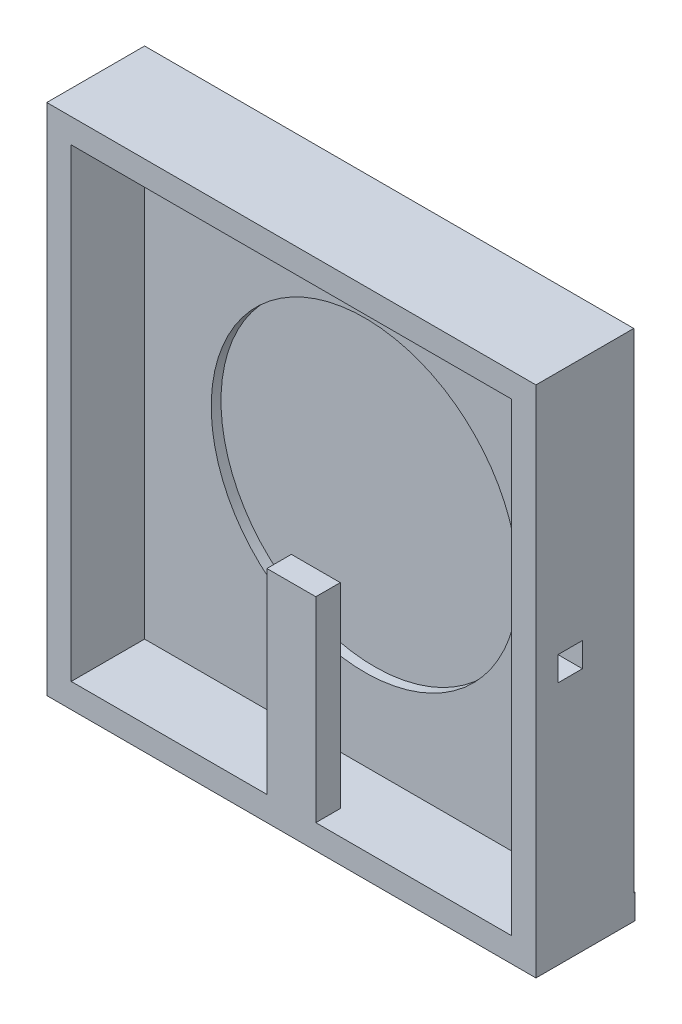
ISO-10303-21;
HEADER;
FILE_DESCRIPTION(('STEP AP214'),'2;1');
FILE_NAME('part.step','',(''),(''),'','','');
FILE_SCHEMA(('AUTOMOTIVE_DESIGN { 1 0 10303 214 1 1 1 1 }'));
ENDSEC;
DATA;
#1=APPLICATION_CONTEXT('core data for automotive mechanical design processes');
#2=APPLICATION_PROTOCOL_DEFINITION('international standard','automotive_design',2000,#1);
#3=PRODUCT_CONTEXT('',#1,'mechanical');
#4=PRODUCT('Part','Part','',(#3));
#5=PRODUCT_RELATED_PRODUCT_CATEGORY('part','',(#4));
#6=PRODUCT_DEFINITION_FORMATION('','',#4);
#7=PRODUCT_DEFINITION_CONTEXT('part definition',#1,'design');
#8=PRODUCT_DEFINITION('design','',#6,#7);
#9=PRODUCT_DEFINITION_SHAPE('','',#8);
#10=(LENGTH_UNIT() NAMED_UNIT(*) SI_UNIT(.MILLI.,.METRE.));
#11=(NAMED_UNIT(*) PLANE_ANGLE_UNIT() SI_UNIT($,.RADIAN.));
#12=(NAMED_UNIT(*) SI_UNIT($,.STERADIAN.) SOLID_ANGLE_UNIT());
#13=UNCERTAINTY_MEASURE_WITH_UNIT(LENGTH_MEASURE(1.E-05),#10,'distance_accuracy_value','');
#14=(GEOMETRIC_REPRESENTATION_CONTEXT(3) GLOBAL_UNCERTAINTY_ASSIGNED_CONTEXT((#13)) GLOBAL_UNIT_ASSIGNED_CONTEXT((#10,
#11,#12)) REPRESENTATION_CONTEXT('',''));
#15=CARTESIAN_POINT('',(0.,0.,0.));
#16=DIRECTION('',(0.,0.,1.));
#17=DIRECTION('',(1.,0.,0.));
#18=AXIS2_PLACEMENT_3D('',#15,#16,#17);
#19=CARTESIAN_POINT('',(0.,50.,0.));
#20=DIRECTION('',(0.,1.,0.));
#21=DIRECTION('',(0.,0.,1.));
#22=AXIS2_PLACEMENT_3D('',#19,#20,#21);
#23=PLANE('',#22);
#24=DIRECTION('',(0.,0.,-1.));
#25=VECTOR('',#24,1.);
#26=CARTESIAN_POINT('',(-500.,50.,-202.973761949593));
#27=LINE('',#26,#25);
#28=CARTESIAN_POINT('',(-500.,50.,-200.));
#29=VERTEX_POINT('',#28);
#30=CARTESIAN_POINT('',(-500.,50.,-202.973761949593));
#31=VERTEX_POINT('',#30);
#32=EDGE_CURVE('E62',#29,#31,#27,.T.);
#33=ORIENTED_EDGE('',*,*,#32,.F.);
#34=DIRECTION('',(1.,0.,0.));
#35=VECTOR('',#34,1.);
#36=CARTESIAN_POINT('',(-500.,50.,-200.));
#37=LINE('',#36,#35);
#38=CARTESIAN_POINT('',(500.,50.,-200.));
#39=VERTEX_POINT('',#38);
#40=EDGE_CURVE('E310',#29,#39,#37,.T.);
#41=ORIENTED_EDGE('',*,*,#40,.T.);
#42=DIRECTION('',(0.,0.,1.));
#43=VECTOR('',#42,1.);
#44=CARTESIAN_POINT('',(500.,50.,-202.973761949593));
#45=LINE('',#44,#43);
#46=CARTESIAN_POINT('',(500.,50.,-202.973761949593));
#47=VERTEX_POINT('',#46);
#48=EDGE_CURVE('E445',#47,#39,#45,.T.);
#49=ORIENTED_EDGE('',*,*,#48,.F.);
#50=DIRECTION('',(1.,0.,0.));
#51=VECTOR('',#50,1.);
#52=CARTESIAN_POINT('',(-750.,50.,-202.973761949593));
#53=LINE('',#52,#51);
#54=EDGE_CURVE('E198',#31,#47,#53,.T.);
#55=ORIENTED_EDGE('',*,*,#54,.F.);
#56=EDGE_LOOP('',(#33,#41,#49,#55));
#57=FACE_BOUND('',#56,.T.);
#58=ADVANCED_FACE('F38',(#57),#23,.T.);
#59=DIRECTION('',(-1.,0.,0.));
#60=VECTOR('',#59,1.);
#61=CARTESIAN_POINT('',(-750.,50.,0.));
#62=LINE('',#61,#60);
#63=CARTESIAN_POINT('',(450.,50.,0.));
#64=VERTEX_POINT('',#63);
#65=CARTESIAN_POINT('',(50.,50.,0.));
#66=VERTEX_POINT('',#65);
#67=EDGE_CURVE('E189',#64,#66,#62,.T.);
#68=ORIENTED_EDGE('',*,*,#67,.F.);
#69=DIRECTION('',(0.,0.,1.));
#70=VECTOR('',#69,1.);
#71=CARTESIAN_POINT('',(450.,50.,-150.));
#72=LINE('',#71,#70);
#73=CARTESIAN_POINT('',(450.,50.,-150.));
#74=VERTEX_POINT('',#73);
#75=EDGE_CURVE('E300',#74,#64,#72,.T.);
#76=ORIENTED_EDGE('',*,*,#75,.F.);
#77=DIRECTION('',(1.,0.,0.));
#78=VECTOR('',#77,1.);
#79=CARTESIAN_POINT('',(-450.,50.,-150.));
#80=LINE('',#79,#78);
#81=CARTESIAN_POINT('',(-450.,50.,-150.));
#82=VERTEX_POINT('',#81);
#83=EDGE_CURVE('E271',#82,#74,#80,.T.);
#84=ORIENTED_EDGE('',*,*,#83,.F.);
#85=DIRECTION('',(0.,0.,1.));
#86=VECTOR('',#85,1.);
#87=CARTESIAN_POINT('',(-450.,50.,-150.));
#88=LINE('',#87,#86);
#89=CARTESIAN_POINT('',(-450.,50.,0.));
#90=VERTEX_POINT('',#89);
#91=EDGE_CURVE('E284',#82,#90,#88,.T.);
#92=ORIENTED_EDGE('',*,*,#91,.T.);
#93=CARTESIAN_POINT('',(-49.9999999999999,50.,0.));
#94=VERTEX_POINT('',#93);
#95=EDGE_CURVE('E195',#94,#90,#62,.T.);
#96=ORIENTED_EDGE('',*,*,#95,.F.);
#97=DIRECTION('',(0.,0.,1.));
#98=VECTOR('',#97,1.);
#99=CARTESIAN_POINT('',(-50.,50.,-50.));
#100=LINE('',#99,#98);
#101=CARTESIAN_POINT('',(-50.,50.,-50.));
#102=VERTEX_POINT('',#101);
#103=EDGE_CURVE('E218',#102,#94,#100,.T.);
#104=ORIENTED_EDGE('',*,*,#103,.F.);
#105=DIRECTION('',(-1.,0.,0.));
#106=VECTOR('',#105,1.);
#107=CARTESIAN_POINT('',(-50.,50.,-50.));
#108=LINE('',#107,#106);
#109=CARTESIAN_POINT('',(50.,50.,-50.));
#110=VERTEX_POINT('',#109);
#111=EDGE_CURVE('E233',#110,#102,#108,.T.);
#112=ORIENTED_EDGE('',*,*,#111,.F.);
#113=DIRECTION('',(0.,0.,-1.));
#114=VECTOR('',#113,1.);
#115=CARTESIAN_POINT('',(50.,50.,-50.));
#116=LINE('',#115,#114);
#117=EDGE_CURVE('E246',#66,#110,#116,.T.);
#118=ORIENTED_EDGE('',*,*,#117,.F.);
#119=EDGE_LOOP('',(#68,#76,#84,#92,#96,#104,#112,#118));
#120=FACE_BOUND('',#119,.T.);
#121=ADVANCED_FACE('F375',(#120),#23,.T.);
#122=CARTESIAN_POINT('',(0.,0.,0.));
#123=DIRECTION('',(0.,1.,0.));
#124=DIRECTION('',(0.,0.,1.));
#125=AXIS2_PLACEMENT_3D('',#122,#123,#124);
#126=PLANE('',#125);
#127=DIRECTION('',(-1.,0.,0.));
#128=VECTOR('',#127,1.);
#129=CARTESIAN_POINT('',(-750.,0.,0.));
#130=LINE('',#129,#128);
#131=CARTESIAN_POINT('',(500.,0.,0.));
#132=VERTEX_POINT('',#131);
#133=CARTESIAN_POINT('',(-500.,0.,0.));
#134=VERTEX_POINT('',#133);
#135=EDGE_CURVE('E171',#132,#134,#130,.T.);
#136=ORIENTED_EDGE('',*,*,#135,.T.);
#137=DIRECTION('',(0.,0.,-1.));
#138=VECTOR('',#137,1.);
#139=CARTESIAN_POINT('',(-500.,0.,-202.973761949593));
#140=LINE('',#139,#138);
#141=CARTESIAN_POINT('',(-500.,0.,-202.973761949593));
#142=VERTEX_POINT('',#141);
#143=EDGE_CURVE('E179',#134,#142,#140,.T.);
#144=ORIENTED_EDGE('',*,*,#143,.T.);
#145=DIRECTION('',(1.,0.,0.));
#146=VECTOR('',#145,1.);
#147=CARTESIAN_POINT('',(-750.,0.,-202.973761949593));
#148=LINE('',#147,#146);
#149=CARTESIAN_POINT('',(500.,0.,-202.973761949593));
#150=VERTEX_POINT('',#149);
#151=EDGE_CURVE('E201',#142,#150,#148,.T.);
#152=ORIENTED_EDGE('',*,*,#151,.T.);
#153=DIRECTION('',(0.,0.,1.));
#154=VECTOR('',#153,1.);
#155=CARTESIAN_POINT('',(500.,0.,-202.973761949593));
#156=LINE('',#155,#154);
#157=EDGE_CURVE('E54',#150,#132,#156,.T.);
#158=ORIENTED_EDGE('',*,*,#157,.T.);
#159=EDGE_LOOP('',(#136,#144,#152,#158));
#160=FACE_BOUND('',#159,.T.);
#161=ADVANCED_FACE('F40',(#160),#126,.F.);
#162=CARTESIAN_POINT('',(-500.,1050.,-200.));
#163=DIRECTION('',(-1.,0.,0.));
#164=DIRECTION('',(0.,-1.,0.));
#165=AXIS2_PLACEMENT_3D('',#162,#163,#164);
#166=PLANE('',#165);
#167=DIRECTION('',(0.,-1.,0.));
#168=VECTOR('',#167,1.);
#169=CARTESIAN_POINT('',(-500.,1050.,0.));
#170=LINE('',#169,#168);
#171=CARTESIAN_POINT('',(-500.,1050.,0.));
#172=VERTEX_POINT('',#171);
#173=EDGE_CURVE('E165',#172,#134,#170,.T.);
#174=ORIENTED_EDGE('',*,*,#173,.F.);
#175=DIRECTION('',(0.,0.,1.));
#176=VECTOR('',#175,1.);
#177=CARTESIAN_POINT('',(-500.,1050.,-200.));
#178=LINE('',#177,#176);
#179=CARTESIAN_POINT('',(-500.,1050.,-200.));
#180=VERTEX_POINT('',#179);
#181=EDGE_CURVE('E327',#180,#172,#178,.T.);
#182=ORIENTED_EDGE('',*,*,#181,.F.);
#183=DIRECTION('',(0.,-1.,0.));
#184=VECTOR('',#183,1.);
#185=CARTESIAN_POINT('',(-500.,1050.,-200.));
#186=LINE('',#185,#184);
#187=EDGE_CURVE('E307',#180,#29,#186,.T.);
#188=ORIENTED_EDGE('',*,*,#187,.T.);
#189=ORIENTED_EDGE('',*,*,#32,.T.);
#190=DIRECTION('',(0.,1.,0.));
#191=VECTOR('',#190,1.);
#192=CARTESIAN_POINT('',(-500.,0.,-202.973761949593));
#193=LINE('',#192,#191);
#194=EDGE_CURVE('E181',#142,#31,#193,.T.);
#195=ORIENTED_EDGE('',*,*,#194,.F.);
#196=ORIENTED_EDGE('',*,*,#143,.F.);
#197=EDGE_LOOP('',(#174,#182,#188,#189,#195,#196));
#198=FACE_BOUND('',#197,.T.);
#199=ADVANCED_FACE('F180',(#198),#166,.T.);
#200=CARTESIAN_POINT('',(-500.,1050.,-200.));
#201=DIRECTION('',(0.,1.,0.));
#202=DIRECTION('',(-1.,0.,0.));
#203=AXIS2_PLACEMENT_3D('',#200,#201,#202);
#204=PLANE('',#203);
#205=DIRECTION('',(-1.,0.,0.));
#206=VECTOR('',#205,1.);
#207=CARTESIAN_POINT('',(-500.,1050.,0.));
#208=LINE('',#207,#206);
#209=CARTESIAN_POINT('',(500.,1050.,0.));
#210=VERTEX_POINT('',#209);
#211=EDGE_CURVE('E173',#210,#172,#208,.T.);
#212=ORIENTED_EDGE('',*,*,#211,.F.);
#213=DIRECTION('',(0.,0.,1.));
#214=VECTOR('',#213,1.);
#215=CARTESIAN_POINT('',(500.,1050.,-200.));
#216=LINE('',#215,#214);
#217=CARTESIAN_POINT('',(500.,1050.,-200.));
#218=VERTEX_POINT('',#217);
#219=EDGE_CURVE('E321',#218,#210,#216,.T.);
#220=ORIENTED_EDGE('',*,*,#219,.F.);
#221=DIRECTION('',(-1.,0.,0.));
#222=VECTOR('',#221,1.);
#223=CARTESIAN_POINT('',(-500.,1050.,-200.));
#224=LINE('',#223,#222);
#225=EDGE_CURVE('E318',#218,#180,#224,.T.);
#226=ORIENTED_EDGE('',*,*,#225,.T.);
#227=ORIENTED_EDGE('',*,*,#181,.T.);
#228=EDGE_LOOP('',(#212,#220,#226,#227));
#229=FACE_BOUND('',#228,.T.);
#230=ADVANCED_FACE('F384',(#229),#204,.T.);
#231=CARTESIAN_POINT('',(500.,1050.,-200.));
#232=DIRECTION('',(1.,0.,0.));
#233=DIRECTION('',(0.,1.,0.));
#234=AXIS2_PLACEMENT_3D('',#231,#232,#233);
#235=PLANE('',#234);
#236=DIRECTION('',(0.,1.,0.));
#237=VECTOR('',#236,1.);
#238=CARTESIAN_POINT('',(500.,550.,-95.));
#239=LINE('',#238,#237);
#240=CARTESIAN_POINT('',(500.,500.,-95.));
#241=VERTEX_POINT('',#240);
#242=CARTESIAN_POINT('',(500.,550.,-95.));
#243=VERTEX_POINT('',#242);
#244=EDGE_CURVE('E188',#241,#243,#239,.T.);
#245=ORIENTED_EDGE('',*,*,#244,.F.);
#246=DIRECTION('',(0.,0.,-1.));
#247=VECTOR('',#246,1.);
#248=CARTESIAN_POINT('',(500.,500.,-45.));
#249=LINE('',#248,#247);
#250=CARTESIAN_POINT('',(500.,500.,-45.));
#251=VERTEX_POINT('',#250);
#252=EDGE_CURVE('E210',#251,#241,#249,.T.);
#253=ORIENTED_EDGE('',*,*,#252,.F.);
#254=DIRECTION('',(0.,-1.,0.));
#255=VECTOR('',#254,1.);
#256=CARTESIAN_POINT('',(500.,550.,-45.));
#257=LINE('',#256,#255);
#258=CARTESIAN_POINT('',(500.,550.,-45.));
#259=VERTEX_POINT('',#258);
#260=EDGE_CURVE('E206',#259,#251,#257,.T.);
#261=ORIENTED_EDGE('',*,*,#260,.F.);
#262=DIRECTION('',(0.,0.,1.));
#263=VECTOR('',#262,1.);
#264=CARTESIAN_POINT('',(500.,550.,-45.));
#265=LINE('',#264,#263);
#266=EDGE_CURVE('E193',#243,#259,#265,.T.);
#267=ORIENTED_EDGE('',*,*,#266,.F.);
#268=EDGE_LOOP('',(#245,#253,#261,#267));
#269=FACE_BOUND('',#268,.T.);
#270=DIRECTION('',(0.,1.,0.));
#271=VECTOR('',#270,1.);
#272=CARTESIAN_POINT('',(500.,1050.,0.));
#273=LINE('',#272,#271);
#274=EDGE_CURVE('E175',#132,#210,#273,.T.);
#275=ORIENTED_EDGE('',*,*,#274,.F.);
#276=ORIENTED_EDGE('',*,*,#157,.F.);
#277=DIRECTION('',(0.,1.,0.));
#278=VECTOR('',#277,1.);
#279=CARTESIAN_POINT('',(500.,0.,-202.973761949593));
#280=LINE('',#279,#278);
#281=EDGE_CURVE('E456',#150,#47,#280,.T.);
#282=ORIENTED_EDGE('',*,*,#281,.T.);
#283=ORIENTED_EDGE('',*,*,#48,.T.);
#284=DIRECTION('',(0.,1.,0.));
#285=VECTOR('',#284,1.);
#286=CARTESIAN_POINT('',(500.,1050.,-200.));
#287=LINE('',#286,#285);
#288=EDGE_CURVE('E314',#39,#218,#287,.T.);
#289=ORIENTED_EDGE('',*,*,#288,.T.);
#290=ORIENTED_EDGE('',*,*,#219,.T.);
#291=EDGE_LOOP('',(#275,#276,#282,#283,#289,#290));
#292=FACE_BOUND('',#291,.T.);
#293=ADVANCED_FACE('F356',(#269,#292),#235,.T.);
#294=CARTESIAN_POINT('',(0.,0.,-200.));
#295=DIRECTION('',(0.,0.,1.));
#296=DIRECTION('',(1.,0.,0.));
#297=AXIS2_PLACEMENT_3D('',#294,#295,#296);
#298=PLANE('',#297);
#299=ORIENTED_EDGE('',*,*,#187,.F.);
#300=ORIENTED_EDGE('',*,*,#225,.F.);
#301=ORIENTED_EDGE('',*,*,#288,.F.);
#302=ORIENTED_EDGE('',*,*,#40,.F.);
#303=EDGE_LOOP('',(#299,#300,#301,#302));
#304=FACE_BOUND('',#303,.T.);
#305=ADVANCED_FACE('F387',(#304),#298,.F.);
#306=CARTESIAN_POINT('',(0.,0.,0.));
#307=DIRECTION('',(0.,0.,1.));
#308=DIRECTION('',(1.,0.,0.));
#309=AXIS2_PLACEMENT_3D('',#306,#307,#308);
#310=PLANE('',#309);
#311=ORIENTED_EDGE('',*,*,#173,.T.);
#312=ORIENTED_EDGE('',*,*,#135,.F.);
#313=ORIENTED_EDGE('',*,*,#274,.T.);
#314=ORIENTED_EDGE('',*,*,#211,.T.);
#315=EDGE_LOOP('',(#311,#312,#313,#314));
#316=FACE_BOUND('',#315,.T.);
#317=ORIENTED_EDGE('',*,*,#95,.T.);
#318=DIRECTION('',(0.,-1.,0.));
#319=VECTOR('',#318,1.);
#320=CARTESIAN_POINT('',(-450.,1000.,0.));
#321=LINE('',#320,#319);
#322=CARTESIAN_POINT('',(-450.,1000.,0.));
#323=VERTEX_POINT('',#322);
#324=EDGE_CURVE('E266',#323,#90,#321,.T.);
#325=ORIENTED_EDGE('',*,*,#324,.F.);
#326=DIRECTION('',(-1.,0.,0.));
#327=VECTOR('',#326,1.);
#328=CARTESIAN_POINT('',(-450.,1000.,0.));
#329=LINE('',#328,#327);
#330=CARTESIAN_POINT('',(450.,1000.,0.));
#331=VERTEX_POINT('',#330);
#332=EDGE_CURVE('E272',#331,#323,#329,.T.);
#333=ORIENTED_EDGE('',*,*,#332,.F.);
#334=DIRECTION('',(0.,1.,0.));
#335=VECTOR('',#334,1.);
#336=CARTESIAN_POINT('',(450.,1000.,0.));
#337=LINE('',#336,#335);
#338=EDGE_CURVE('E288',#64,#331,#337,.T.);
#339=ORIENTED_EDGE('',*,*,#338,.F.);
#340=ORIENTED_EDGE('',*,*,#67,.T.);
#341=DIRECTION('',(0.,-1.,0.));
#342=VECTOR('',#341,1.);
#343=CARTESIAN_POINT('',(50.,450.,0.));
#344=LINE('',#343,#342);
#345=CARTESIAN_POINT('',(50.,450.,0.));
#346=VERTEX_POINT('',#345);
#347=EDGE_CURVE('E258',#346,#66,#344,.T.);
#348=ORIENTED_EDGE('',*,*,#347,.F.);
#349=DIRECTION('',(1.,0.,0.));
#350=VECTOR('',#349,1.);
#351=CARTESIAN_POINT('',(-50.,450.,0.));
#352=LINE('',#351,#350);
#353=CARTESIAN_POINT('',(-50.,450.,0.));
#354=VERTEX_POINT('',#353);
#355=EDGE_CURVE('E232',#354,#346,#352,.T.);
#356=ORIENTED_EDGE('',*,*,#355,.F.);
#357=DIRECTION('',(0.,-1.,0.));
#358=VECTOR('',#357,1.);
#359=CARTESIAN_POINT('',(-50.,450.,0.));
#360=LINE('',#359,#358);
#361=EDGE_CURVE('E262',#354,#94,#360,.T.);
#362=ORIENTED_EDGE('',*,*,#361,.T.);
#363=EDGE_LOOP('',(#317,#325,#333,#339,#340,#348,#356,#362));
#364=FACE_BOUND('',#363,.T.);
#365=ADVANCED_FACE('F167',(#316,#364),#310,.T.);
#366=CARTESIAN_POINT('',(-450.,1000.,-150.));
#367=DIRECTION('',(-1.,0.,0.));
#368=DIRECTION('',(0.,-1.,0.));
#369=AXIS2_PLACEMENT_3D('',#366,#367,#368);
#370=PLANE('',#369);
#371=ORIENTED_EDGE('',*,*,#324,.T.);
#372=ORIENTED_EDGE('',*,*,#91,.F.);
#373=DIRECTION('',(0.,-1.,0.));
#374=VECTOR('',#373,1.);
#375=CARTESIAN_POINT('',(-450.,1000.,-150.));
#376=LINE('',#375,#374);
#377=CARTESIAN_POINT('',(-450.,1000.,-150.));
#378=VERTEX_POINT('',#377);
#379=EDGE_CURVE('E267',#378,#82,#376,.T.);
#380=ORIENTED_EDGE('',*,*,#379,.F.);
#381=DIRECTION('',(0.,0.,1.));
#382=VECTOR('',#381,1.);
#383=CARTESIAN_POINT('',(-450.,1000.,-150.));
#384=LINE('',#383,#382);
#385=EDGE_CURVE('E176',#378,#323,#384,.T.);
#386=ORIENTED_EDGE('',*,*,#385,.T.);
#387=EDGE_LOOP('',(#371,#372,#380,#386));
#388=FACE_BOUND('',#387,.T.);
#389=ADVANCED_FACE('F393',(#388),#370,.F.);
#390=CARTESIAN_POINT('',(-450.,1000.,-150.));
#391=DIRECTION('',(0.,1.,0.));
#392=DIRECTION('',(0.,0.,1.));
#393=AXIS2_PLACEMENT_3D('',#390,#391,#392);
#394=PLANE('',#393);
#395=ORIENTED_EDGE('',*,*,#332,.T.);
#396=ORIENTED_EDGE('',*,*,#385,.F.);
#397=DIRECTION('',(-1.,0.,0.));
#398=VECTOR('',#397,1.);
#399=CARTESIAN_POINT('',(-450.,1000.,-150.));
#400=LINE('',#399,#398);
#401=CARTESIAN_POINT('',(450.,1000.,-150.));
#402=VERTEX_POINT('',#401);
#403=EDGE_CURVE('E280',#402,#378,#400,.T.);
#404=ORIENTED_EDGE('',*,*,#403,.F.);
#405=DIRECTION('',(0.,0.,1.));
#406=VECTOR('',#405,1.);
#407=CARTESIAN_POINT('',(450.,1000.,-150.));
#408=LINE('',#407,#406);
#409=EDGE_CURVE('E297',#402,#331,#408,.T.);
#410=ORIENTED_EDGE('',*,*,#409,.T.);
#411=EDGE_LOOP('',(#395,#396,#404,#410));
#412=FACE_BOUND('',#411,.T.);
#413=ADVANCED_FACE('F399',(#412),#394,.F.);
#414=CARTESIAN_POINT('',(450.,1000.,-150.));
#415=DIRECTION('',(1.,0.,0.));
#416=DIRECTION('',(0.,1.,0.));
#417=AXIS2_PLACEMENT_3D('',#414,#415,#416);
#418=PLANE('',#417);
#419=DIRECTION('',(0.,0.,-1.));
#420=VECTOR('',#419,1.);
#421=CARTESIAN_POINT('',(450.,500.,-150.));
#422=LINE('',#421,#420);
#423=CARTESIAN_POINT('',(450.,500.,-45.));
#424=VERTEX_POINT('',#423);
#425=CARTESIAN_POINT('',(450.,500.,-95.));
#426=VERTEX_POINT('',#425);
#427=EDGE_CURVE('E47',#424,#426,#422,.T.);
#428=ORIENTED_EDGE('',*,*,#427,.T.);
#429=DIRECTION('',(0.,1.,0.));
#430=VECTOR('',#429,1.);
#431=CARTESIAN_POINT('',(450.,1000.,-94.9999999999999));
#432=LINE('',#431,#430);
#433=CARTESIAN_POINT('',(450.,550.,-95.));
#434=VERTEX_POINT('',#433);
#435=EDGE_CURVE('E11',#426,#434,#432,.T.);
#436=ORIENTED_EDGE('',*,*,#435,.T.);
#437=DIRECTION('',(0.,0.,1.));
#438=VECTOR('',#437,1.);
#439=CARTESIAN_POINT('',(450.,550.,-150.));
#440=LINE('',#439,#438);
#441=CARTESIAN_POINT('',(450.,550.,-45.));
#442=VERTEX_POINT('',#441);
#443=EDGE_CURVE('E330',#434,#442,#440,.T.);
#444=ORIENTED_EDGE('',*,*,#443,.T.);
#445=DIRECTION('',(0.,-1.,0.));
#446=VECTOR('',#445,1.);
#447=CARTESIAN_POINT('',(450.,1000.,-45.));
#448=LINE('',#447,#446);
#449=EDGE_CURVE('E336',#442,#424,#448,.T.);
#450=ORIENTED_EDGE('',*,*,#449,.T.);
#451=EDGE_LOOP('',(#428,#436,#444,#450));
#452=FACE_BOUND('',#451,.T.);
#453=ORIENTED_EDGE('',*,*,#338,.T.);
#454=ORIENTED_EDGE('',*,*,#409,.F.);
#455=DIRECTION('',(0.,1.,0.));
#456=VECTOR('',#455,1.);
#457=CARTESIAN_POINT('',(450.,1000.,-150.));
#458=LINE('',#457,#456);
#459=EDGE_CURVE('E276',#74,#402,#458,.T.);
#460=ORIENTED_EDGE('',*,*,#459,.F.);
#461=ORIENTED_EDGE('',*,*,#75,.T.);
#462=EDGE_LOOP('',(#453,#454,#460,#461));
#463=FACE_BOUND('',#462,.T.);
#464=ADVANCED_FACE('F342',(#452,#463),#418,.F.);
#465=CARTESIAN_POINT('',(0.,0.,-150.));
#466=DIRECTION('',(0.,0.,1.));
#467=DIRECTION('',(1.,0.,0.));
#468=AXIS2_PLACEMENT_3D('',#465,#466,#467);
#469=PLANE('',#468);
#470=CARTESIAN_POINT('',(0.,530.,-150.));
#471=DIRECTION('',(0.,0.,1.));
#472=DIRECTION('',(1.,0.,0.));
#473=AXIS2_PLACEMENT_3D('',#470,#471,#472);
#474=CIRCLE('',#473,313.8);
#475=CARTESIAN_POINT('',(313.8,530.,-150.));
#476=VERTEX_POINT('',#475);
#477=EDGE_CURVE('E446',#476,#476,#474,.T.);
#478=ORIENTED_EDGE('',*,*,#477,.F.);
#479=EDGE_LOOP('',(#478));
#480=FACE_BOUND('',#479,.T.);
#481=ORIENTED_EDGE('',*,*,#379,.T.);
#482=ORIENTED_EDGE('',*,*,#83,.T.);
#483=ORIENTED_EDGE('',*,*,#459,.T.);
#484=ORIENTED_EDGE('',*,*,#403,.T.);
#485=EDGE_LOOP('',(#481,#482,#483,#484));
#486=FACE_BOUND('',#485,.T.);
#487=ADVANCED_FACE('F403',(#480,#486),#469,.T.);
#488=CARTESIAN_POINT('',(-50.,450.,-50.));
#489=DIRECTION('',(1.,0.,0.));
#490=DIRECTION('',(0.,0.,-1.));
#491=AXIS2_PLACEMENT_3D('',#488,#489,#490);
#492=PLANE('',#491);
#493=ORIENTED_EDGE('',*,*,#103,.T.);
#494=ORIENTED_EDGE('',*,*,#361,.F.);
#495=DIRECTION('',(0.,0.,1.));
#496=VECTOR('',#495,1.);
#497=CARTESIAN_POINT('',(-50.,450.,-50.));
#498=LINE('',#497,#496);
#499=CARTESIAN_POINT('',(-50.,450.,-50.));
#500=VERTEX_POINT('',#499);
#501=EDGE_CURVE('E228',#500,#354,#498,.T.);
#502=ORIENTED_EDGE('',*,*,#501,.F.);
#503=DIRECTION('',(0.,-1.,0.));
#504=VECTOR('',#503,1.);
#505=CARTESIAN_POINT('',(-50.,450.,-50.));
#506=LINE('',#505,#504);
#507=EDGE_CURVE('E242',#500,#102,#506,.T.);
#508=ORIENTED_EDGE('',*,*,#507,.T.);
#509=EDGE_LOOP('',(#493,#494,#502,#508));
#510=FACE_BOUND('',#509,.T.);
#511=ADVANCED_FACE('F409',(#510),#492,.F.);
#512=CARTESIAN_POINT('',(50.,450.,-50.));
#513=DIRECTION('',(-1.,0.,0.));
#514=DIRECTION('',(0.,0.,1.));
#515=AXIS2_PLACEMENT_3D('',#512,#513,#514);
#516=PLANE('',#515);
#517=ORIENTED_EDGE('',*,*,#117,.T.);
#518=DIRECTION('',(0.,-1.,0.));
#519=VECTOR('',#518,1.);
#520=CARTESIAN_POINT('',(50.,450.,-50.));
#521=LINE('',#520,#519);
#522=CARTESIAN_POINT('',(50.,450.,-50.));
#523=VERTEX_POINT('',#522);
#524=EDGE_CURVE('E255',#523,#110,#521,.T.);
#525=ORIENTED_EDGE('',*,*,#524,.F.);
#526=DIRECTION('',(0.,0.,-1.));
#527=VECTOR('',#526,1.);
#528=CARTESIAN_POINT('',(50.,450.,-50.));
#529=LINE('',#528,#527);
#530=EDGE_CURVE('E236',#346,#523,#529,.T.);
#531=ORIENTED_EDGE('',*,*,#530,.F.);
#532=ORIENTED_EDGE('',*,*,#347,.T.);
#533=EDGE_LOOP('',(#517,#525,#531,#532));
#534=FACE_BOUND('',#533,.T.);
#535=ADVANCED_FACE('F413',(#534),#516,.F.);
#536=CARTESIAN_POINT('',(-50.,450.,-50.));
#537=DIRECTION('',(0.,0.,1.));
#538=DIRECTION('',(1.,0.,0.));
#539=AXIS2_PLACEMENT_3D('',#536,#537,#538);
#540=PLANE('',#539);
#541=ORIENTED_EDGE('',*,*,#111,.T.);
#542=ORIENTED_EDGE('',*,*,#507,.F.);
#543=DIRECTION('',(-1.,0.,0.));
#544=VECTOR('',#543,1.);
#545=CARTESIAN_POINT('',(-50.,450.,-50.));
#546=LINE('',#545,#544);
#547=EDGE_CURVE('E239',#523,#500,#546,.T.);
#548=ORIENTED_EDGE('',*,*,#547,.F.);
#549=ORIENTED_EDGE('',*,*,#524,.T.);
#550=EDGE_LOOP('',(#541,#542,#548,#549));
#551=FACE_BOUND('',#550,.T.);
#552=ADVANCED_FACE('F417',(#551),#540,.F.);
#553=CARTESIAN_POINT('',(0.,450.,0.));
#554=DIRECTION('',(0.,1.,0.));
#555=DIRECTION('',(0.,0.,1.));
#556=AXIS2_PLACEMENT_3D('',#553,#554,#555);
#557=PLANE('',#556);
#558=ORIENTED_EDGE('',*,*,#501,.T.);
#559=ORIENTED_EDGE('',*,*,#355,.T.);
#560=ORIENTED_EDGE('',*,*,#530,.T.);
#561=ORIENTED_EDGE('',*,*,#547,.T.);
#562=EDGE_LOOP('',(#558,#559,#560,#561));
#563=FACE_BOUND('',#562,.T.);
#564=ADVANCED_FACE('F421',(#563),#557,.T.);
#565=CARTESIAN_POINT('',(390.,550.,-95.));
#566=DIRECTION('',(0.,0.,-1.));
#567=DIRECTION('',(0.,1.,0.));
#568=AXIS2_PLACEMENT_3D('',#565,#566,#567);
#569=PLANE('',#568);
#570=DIRECTION('',(1.,0.,0.));
#571=VECTOR('',#570,1.);
#572=CARTESIAN_POINT('',(390.,500.,-95.));
#573=LINE('',#572,#571);
#574=EDGE_CURVE('E215',#426,#241,#573,.T.);
#575=ORIENTED_EDGE('',*,*,#574,.T.);
#576=ORIENTED_EDGE('',*,*,#244,.T.);
#577=DIRECTION('',(1.,0.,0.));
#578=VECTOR('',#577,1.);
#579=CARTESIAN_POINT('',(390.,550.,-95.));
#580=LINE('',#579,#578);
#581=EDGE_CURVE('E214',#434,#243,#580,.T.);
#582=ORIENTED_EDGE('',*,*,#581,.F.);
#583=ORIENTED_EDGE('',*,*,#435,.F.);
#584=EDGE_LOOP('',(#575,#576,#582,#583));
#585=FACE_BOUND('',#584,.T.);
#586=ADVANCED_FACE('F359',(#585),#569,.F.);
#587=CARTESIAN_POINT('',(390.,500.,-45.));
#588=DIRECTION('',(0.,-1.,0.));
#589=DIRECTION('',(1.,0.,0.));
#590=AXIS2_PLACEMENT_3D('',#587,#588,#589);
#591=PLANE('',#590);
#592=DIRECTION('',(1.,0.,0.));
#593=VECTOR('',#592,1.);
#594=CARTESIAN_POINT('',(390.,500.,-45.));
#595=LINE('',#594,#593);
#596=EDGE_CURVE('E219',#424,#251,#595,.T.);
#597=ORIENTED_EDGE('',*,*,#596,.T.);
#598=ORIENTED_EDGE('',*,*,#252,.T.);
#599=ORIENTED_EDGE('',*,*,#574,.F.);
#600=ORIENTED_EDGE('',*,*,#427,.F.);
#601=EDGE_LOOP('',(#597,#598,#599,#600));
#602=FACE_BOUND('',#601,.T.);
#603=ADVANCED_FACE('F348',(#602),#591,.F.);
#604=CARTESIAN_POINT('',(390.,550.,-45.));
#605=DIRECTION('',(0.,0.,1.));
#606=DIRECTION('',(0.,-1.,0.));
#607=AXIS2_PLACEMENT_3D('',#604,#605,#606);
#608=PLANE('',#607);
#609=DIRECTION('',(1.,0.,0.));
#610=VECTOR('',#609,1.);
#611=CARTESIAN_POINT('',(390.,550.,-45.));
#612=LINE('',#611,#610);
#613=EDGE_CURVE('E222',#442,#259,#612,.T.);
#614=ORIENTED_EDGE('',*,*,#613,.T.);
#615=ORIENTED_EDGE('',*,*,#260,.T.);
#616=ORIENTED_EDGE('',*,*,#596,.F.);
#617=ORIENTED_EDGE('',*,*,#449,.F.);
#618=EDGE_LOOP('',(#614,#615,#616,#617));
#619=FACE_BOUND('',#618,.T.);
#620=ADVANCED_FACE('F350',(#619),#608,.F.);
#621=CARTESIAN_POINT('',(390.,550.,-45.));
#622=DIRECTION('',(0.,1.,0.));
#623=DIRECTION('',(-1.,0.,0.));
#624=AXIS2_PLACEMENT_3D('',#621,#622,#623);
#625=PLANE('',#624);
#626=ORIENTED_EDGE('',*,*,#581,.T.);
#627=ORIENTED_EDGE('',*,*,#266,.T.);
#628=ORIENTED_EDGE('',*,*,#613,.F.);
#629=ORIENTED_EDGE('',*,*,#443,.F.);
#630=EDGE_LOOP('',(#626,#627,#628,#629));
#631=FACE_BOUND('',#630,.T.);
#632=ADVANCED_FACE('F361',(#631),#625,.F.);
#633=CARTESIAN_POINT('',(-750.,0.,-202.973761949593));
#634=DIRECTION('',(0.,0.,1.));
#635=DIRECTION('',(1.,0.,0.));
#636=AXIS2_PLACEMENT_3D('',#633,#634,#635);
#637=PLANE('',#636);
#638=ORIENTED_EDGE('',*,*,#151,.F.);
#639=ORIENTED_EDGE('',*,*,#194,.T.);
#640=ORIENTED_EDGE('',*,*,#54,.T.);
#641=ORIENTED_EDGE('',*,*,#281,.F.);
#642=EDGE_LOOP('',(#638,#639,#640,#641));
#643=FACE_BOUND('',#642,.T.);
#644=ADVANCED_FACE('F363',(#643),#637,.F.);
#645=CARTESIAN_POINT('',(0.,530.,-170.));
#646=DIRECTION('',(0.,0.,1.));
#647=DIRECTION('',(1.,0.,0.));
#648=AXIS2_PLACEMENT_3D('',#645,#646,#647);
#649=CYLINDRICAL_SURFACE('',#648,313.8);
#650=CARTESIAN_POINT('',(0.,530.,-170.));
#651=DIRECTION('',(0.,0.,1.));
#652=DIRECTION('',(1.,0.,0.));
#653=AXIS2_PLACEMENT_3D('',#650,#651,#652);
#654=CIRCLE('',#653,313.8);
#655=CARTESIAN_POINT('',(313.8,530.,-170.));
#656=VERTEX_POINT('',#655);
#657=EDGE_CURVE('E443',#656,#656,#654,.T.);
#658=ORIENTED_EDGE('',*,*,#657,.F.);
#659=EDGE_LOOP('',(#658));
#660=FACE_BOUND('',#659,.T.);
#661=ORIENTED_EDGE('',*,*,#477,.T.);
#662=EDGE_LOOP('',(#661));
#663=FACE_BOUND('',#662,.T.);
#664=ADVANCED_FACE('F369',(#660,#663),#649,.F.);
#665=CARTESIAN_POINT('',(0.,530.,-170.));
#666=DIRECTION('',(0.,0.,1.));
#667=DIRECTION('',(1.,0.,0.));
#668=AXIS2_PLACEMENT_3D('',#665,#666,#667);
#669=PLANE('',#668);
#670=ORIENTED_EDGE('',*,*,#657,.T.);
#671=EDGE_LOOP('',(#670));
#672=FACE_BOUND('',#671,.T.);
#673=ADVANCED_FACE('F435',(#672),#669,.T.);
#674=CLOSED_SHELL('',(#58,#121,#161,#199,#230,#293,#305,#365,#389,#413,#464,#487,#511,#535,#552,
#564,#586,#603,#620,#632,#644,#664,#673));
#675=MANIFOLD_SOLID_BREP('B2',#674);
#676=ADVANCED_BREP_SHAPE_REPRESENTATION('',(#18,#675),#14);
#677=SHAPE_DEFINITION_REPRESENTATION(#9,#676);
ENDSEC;
END-ISO-10303-21;
